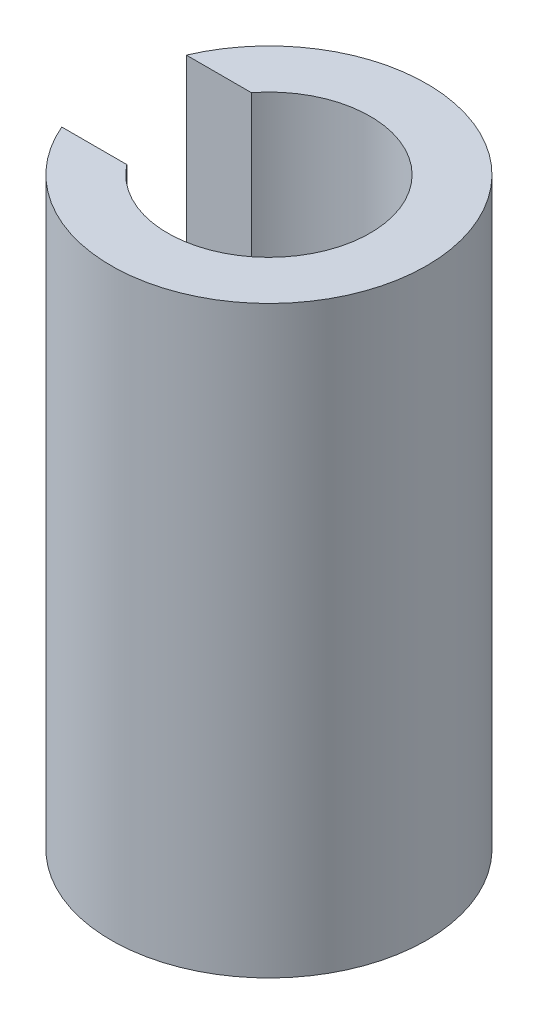
ISO-10303-21;
HEADER;
FILE_DESCRIPTION(('STEP AP214'),'2;1');
FILE_NAME('part.step','',(''),(''),'','','');
FILE_SCHEMA(('AUTOMOTIVE_DESIGN { 1 0 10303 214 1 1 1 1 }'));
ENDSEC;
DATA;
#1=APPLICATION_CONTEXT('core data for automotive mechanical design processes');
#2=APPLICATION_PROTOCOL_DEFINITION('international standard','automotive_design',2000,#1);
#3=PRODUCT_CONTEXT('',#1,'mechanical');
#4=PRODUCT('Part','Part','',(#3));
#5=PRODUCT_RELATED_PRODUCT_CATEGORY('part','',(#4));
#6=PRODUCT_DEFINITION_FORMATION('','',#4);
#7=PRODUCT_DEFINITION_CONTEXT('part definition',#1,'design');
#8=PRODUCT_DEFINITION('design','',#6,#7);
#9=PRODUCT_DEFINITION_SHAPE('','',#8);
#10=(LENGTH_UNIT() NAMED_UNIT(*) SI_UNIT(.MILLI.,.METRE.));
#11=(NAMED_UNIT(*) PLANE_ANGLE_UNIT() SI_UNIT($,.RADIAN.));
#12=(NAMED_UNIT(*) SI_UNIT($,.STERADIAN.) SOLID_ANGLE_UNIT());
#13=UNCERTAINTY_MEASURE_WITH_UNIT(LENGTH_MEASURE(1.E-05),#10,'distance_accuracy_value','');
#14=(GEOMETRIC_REPRESENTATION_CONTEXT(3) GLOBAL_UNCERTAINTY_ASSIGNED_CONTEXT((#13)) GLOBAL_UNIT_ASSIGNED_CONTEXT((#10,
#11,#12)) REPRESENTATION_CONTEXT('',''));
#15=CARTESIAN_POINT('',(0.,0.,0.));
#16=DIRECTION('',(0.,0.,1.));
#17=DIRECTION('',(1.,0.,0.));
#18=AXIS2_PLACEMENT_3D('',#15,#16,#17);
#19=CARTESIAN_POINT('',(0.,15.,0.));
#20=DIRECTION('',(0.,1.,0.));
#21=DIRECTION('',(0.,0.,1.));
#22=AXIS2_PLACEMENT_3D('',#19,#20,#21);
#23=PLANE('',#22);
#24=DIRECTION('',(-1.,0.,0.));
#25=VECTOR('',#24,1.);
#26=CARTESIAN_POINT('',(-4.05,15.,-1.59921855917195));
#27=LINE('',#26,#25);
#28=CARTESIAN_POINT('',(-2.05,15.,-1.59921855917195));
#29=VERTEX_POINT('',#28);
#30=CARTESIAN_POINT('',(-3.72088699102781,15.,-1.59921855917195));
#31=VERTEX_POINT('',#30);
#32=EDGE_CURVE('E97',#29,#31,#27,.T.);
#33=ORIENTED_EDGE('',*,*,#32,.F.);
#34=CARTESIAN_POINT('',(0.,15.,0.));
#35=DIRECTION('',(0.,1.,0.));
#36=DIRECTION('',(0.,0.,1.));
#37=AXIS2_PLACEMENT_3D('',#34,#35,#36);
#38=CIRCLE('',#37,2.6);
#39=CARTESIAN_POINT('',(-2.05,15.,1.59921855917195));
#40=VERTEX_POINT('',#39);
#41=EDGE_CURVE('E101',#40,#29,#38,.T.);
#42=ORIENTED_EDGE('',*,*,#41,.F.);
#43=DIRECTION('',(1.,0.,0.));
#44=VECTOR('',#43,1.);
#45=CARTESIAN_POINT('',(-4.05,15.,1.59921855917195));
#46=LINE('',#45,#44);
#47=CARTESIAN_POINT('',(-3.72088699102781,15.,1.59921855917195));
#48=VERTEX_POINT('',#47);
#49=EDGE_CURVE('E63',#48,#40,#46,.T.);
#50=ORIENTED_EDGE('',*,*,#49,.F.);
#51=CARTESIAN_POINT('',(0.,15.,0.));
#52=DIRECTION('',(0.,1.,0.));
#53=DIRECTION('',(0.,0.,1.));
#54=AXIS2_PLACEMENT_3D('',#51,#52,#53);
#55=CIRCLE('',#54,4.05);
#56=EDGE_CURVE('E11',#48,#31,#55,.T.);
#57=ORIENTED_EDGE('',*,*,#56,.T.);
#58=EDGE_LOOP('',(#33,#42,#50,#57));
#59=FACE_BOUND('',#58,.T.);
#60=ADVANCED_FACE('F39',(#59),#23,.T.);
#61=CARTESIAN_POINT('',(0.,0.,0.));
#62=DIRECTION('',(0.,1.,0.));
#63=DIRECTION('',(0.,0.,1.));
#64=AXIS2_PLACEMENT_3D('',#61,#62,#63);
#65=PLANE('',#64);
#66=CARTESIAN_POINT('',(0.,0.,0.));
#67=DIRECTION('',(0.,1.,0.));
#68=DIRECTION('',(0.,0.,1.));
#69=AXIS2_PLACEMENT_3D('',#66,#67,#68);
#70=CIRCLE('',#69,2.6);
#71=CARTESIAN_POINT('',(-2.05,0.,1.59921855917195));
#72=VERTEX_POINT('',#71);
#73=CARTESIAN_POINT('',(-2.05,0.,-1.59921855917195));
#74=VERTEX_POINT('',#73);
#75=EDGE_CURVE('E94',#72,#74,#70,.T.);
#76=ORIENTED_EDGE('',*,*,#75,.T.);
#77=DIRECTION('',(-1.,0.,0.));
#78=VECTOR('',#77,1.);
#79=CARTESIAN_POINT('',(-4.05,0.,-1.59921855917195));
#80=LINE('',#79,#78);
#81=CARTESIAN_POINT('',(-3.72088699102781,0.,-1.59921855917195));
#82=VERTEX_POINT('',#81);
#83=EDGE_CURVE('E55',#74,#82,#80,.T.);
#84=ORIENTED_EDGE('',*,*,#83,.T.);
#85=CARTESIAN_POINT('',(0.,0.,0.));
#86=DIRECTION('',(0.,1.,0.));
#87=DIRECTION('',(0.,0.,1.));
#88=AXIS2_PLACEMENT_3D('',#85,#86,#87);
#89=CIRCLE('',#88,4.05);
#90=CARTESIAN_POINT('',(-3.72088699102781,0.,1.59921855917195));
#91=VERTEX_POINT('',#90);
#92=EDGE_CURVE('E43',#91,#82,#89,.T.);
#93=ORIENTED_EDGE('',*,*,#92,.F.);
#94=DIRECTION('',(1.,0.,0.));
#95=VECTOR('',#94,1.);
#96=CARTESIAN_POINT('',(-4.05,0.,1.59921855917195));
#97=LINE('',#96,#95);
#98=EDGE_CURVE('E81',#91,#72,#97,.T.);
#99=ORIENTED_EDGE('',*,*,#98,.T.);
#100=EDGE_LOOP('',(#76,#84,#93,#99));
#101=FACE_BOUND('',#100,.T.);
#102=ADVANCED_FACE('F93',(#101),#65,.F.);
#103=CARTESIAN_POINT('',(0.,15.,0.));
#104=DIRECTION('',(0.,-1.,0.));
#105=DIRECTION('',(0.,0.,-1.));
#106=AXIS2_PLACEMENT_3D('',#103,#104,#105);
#107=CYLINDRICAL_SURFACE('',#106,4.05);
#108=ORIENTED_EDGE('',*,*,#92,.T.);
#109=DIRECTION('',(0.,-1.,0.));
#110=VECTOR('',#109,1.);
#111=CARTESIAN_POINT('',(-3.72088699102781,15.,-1.59921855917195));
#112=LINE('',#111,#110);
#113=EDGE_CURVE('E102',#82,#31,#112,.F.);
#114=ORIENTED_EDGE('',*,*,#113,.T.);
#115=ORIENTED_EDGE('',*,*,#56,.F.);
#116=DIRECTION('',(0.,-1.,0.));
#117=VECTOR('',#116,1.);
#118=CARTESIAN_POINT('',(-3.72088699102781,15.,1.59921855917195));
#119=LINE('',#118,#117);
#120=EDGE_CURVE('E108',#48,#91,#119,.T.);
#121=ORIENTED_EDGE('',*,*,#120,.T.);
#122=EDGE_LOOP('',(#108,#114,#115,#121));
#123=FACE_BOUND('',#122,.T.);
#124=ADVANCED_FACE('F41',(#123),#107,.T.);
#125=CARTESIAN_POINT('',(0.,15.,0.));
#126=DIRECTION('',(0.,-1.,0.));
#127=DIRECTION('',(0.,0.,-1.));
#128=AXIS2_PLACEMENT_3D('',#125,#126,#127);
#129=CYLINDRICAL_SURFACE('',#128,2.6);
#130=DIRECTION('',(0.,1.,0.));
#131=VECTOR('',#130,1.);
#132=CARTESIAN_POINT('',(-2.05,0.,-1.59921855917195));
#133=LINE('',#132,#131);
#134=EDGE_CURVE('E88',#74,#29,#133,.T.);
#135=ORIENTED_EDGE('',*,*,#134,.F.);
#136=ORIENTED_EDGE('',*,*,#75,.F.);
#137=DIRECTION('',(0.,1.,0.));
#138=VECTOR('',#137,1.);
#139=CARTESIAN_POINT('',(-2.05,0.,1.59921855917195));
#140=LINE('',#139,#138);
#141=EDGE_CURVE('E78',#72,#40,#140,.T.);
#142=ORIENTED_EDGE('',*,*,#141,.T.);
#143=ORIENTED_EDGE('',*,*,#41,.T.);
#144=EDGE_LOOP('',(#135,#136,#142,#143));
#145=FACE_BOUND('',#144,.T.);
#146=ADVANCED_FACE('F99',(#145),#129,.F.);
#147=CARTESIAN_POINT('',(-4.05,0.,1.59921855917195));
#148=DIRECTION('',(0.,0.,1.));
#149=DIRECTION('',(1.,0.,0.));
#150=AXIS2_PLACEMENT_3D('',#147,#148,#149);
#151=PLANE('',#150);
#152=ORIENTED_EDGE('',*,*,#49,.T.);
#153=ORIENTED_EDGE('',*,*,#141,.F.);
#154=ORIENTED_EDGE('',*,*,#98,.F.);
#155=ORIENTED_EDGE('',*,*,#120,.F.);
#156=EDGE_LOOP('',(#152,#153,#154,#155));
#157=FACE_BOUND('',#156,.T.);
#158=ADVANCED_FACE('F80',(#157),#151,.F.);
#159=CARTESIAN_POINT('',(-4.05,0.,-1.59921855917195));
#160=DIRECTION('',(0.,0.,-1.));
#161=DIRECTION('',(-1.,0.,0.));
#162=AXIS2_PLACEMENT_3D('',#159,#160,#161);
#163=PLANE('',#162);
#164=ORIENTED_EDGE('',*,*,#83,.F.);
#165=ORIENTED_EDGE('',*,*,#134,.T.);
#166=ORIENTED_EDGE('',*,*,#32,.T.);
#167=ORIENTED_EDGE('',*,*,#113,.F.);
#168=EDGE_LOOP('',(#164,#165,#166,#167));
#169=FACE_BOUND('',#168,.T.);
#170=ADVANCED_FACE('F125',(#169),#163,.F.);
#171=CLOSED_SHELL('',(#60,#102,#124,#146,#158,#170));
#172=MANIFOLD_SOLID_BREP('B2',#171);
#173=ADVANCED_BREP_SHAPE_REPRESENTATION('',(#18,#172),#14);
#174=SHAPE_DEFINITION_REPRESENTATION(#9,#173);
ENDSEC;
END-ISO-10303-21;
